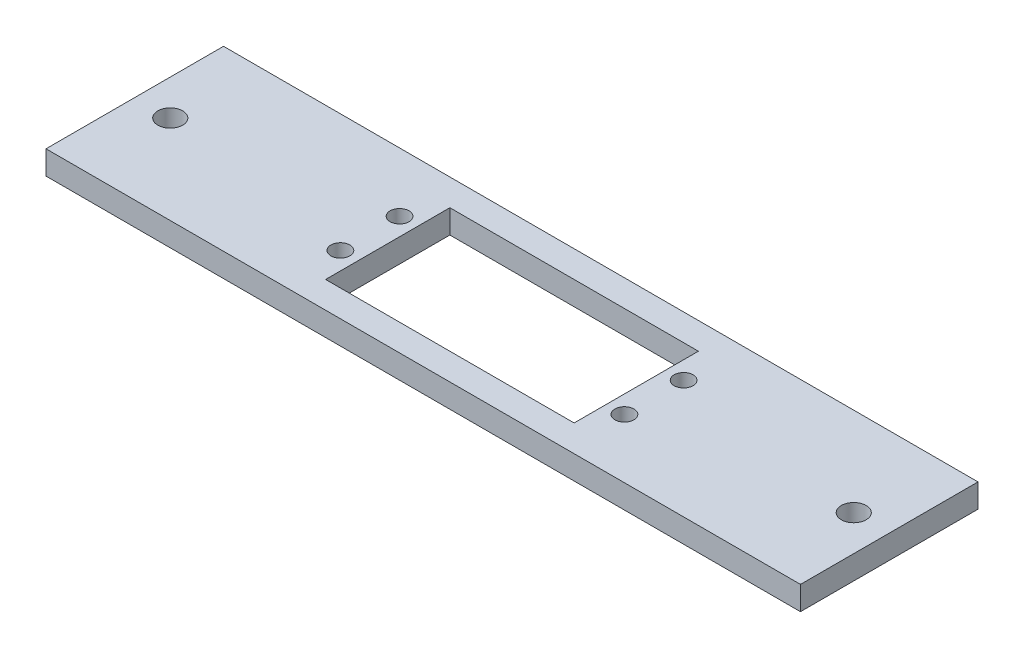
ISO-10303-21;
HEADER;
FILE_DESCRIPTION(('STEP AP214'),'2;1');
FILE_NAME('part.step','',(''),(''),'','','');
FILE_SCHEMA(('AUTOMOTIVE_DESIGN { 1 0 10303 214 1 1 1 1 }'));
ENDSEC;
DATA;
#1=APPLICATION_CONTEXT('core data for automotive mechanical design processes');
#2=APPLICATION_PROTOCOL_DEFINITION('international standard','automotive_design',2000,#1);
#3=PRODUCT_CONTEXT('',#1,'mechanical');
#4=PRODUCT('Part','Part','',(#3));
#5=PRODUCT_RELATED_PRODUCT_CATEGORY('part','',(#4));
#6=PRODUCT_DEFINITION_FORMATION('','',#4);
#7=PRODUCT_DEFINITION_CONTEXT('part definition',#1,'design');
#8=PRODUCT_DEFINITION('design','',#6,#7);
#9=PRODUCT_DEFINITION_SHAPE('','',#8);
#10=(LENGTH_UNIT() NAMED_UNIT(*) SI_UNIT(.MILLI.,.METRE.));
#11=(NAMED_UNIT(*) PLANE_ANGLE_UNIT() SI_UNIT($,.RADIAN.));
#12=(NAMED_UNIT(*) SI_UNIT($,.STERADIAN.) SOLID_ANGLE_UNIT());
#13=UNCERTAINTY_MEASURE_WITH_UNIT(LENGTH_MEASURE(1.E-05),#10,'distance_accuracy_value','');
#14=(GEOMETRIC_REPRESENTATION_CONTEXT(3) GLOBAL_UNCERTAINTY_ASSIGNED_CONTEXT((#13)) GLOBAL_UNIT_ASSIGNED_CONTEXT((#10,
#11,#12)) REPRESENTATION_CONTEXT('',''));
#15=CARTESIAN_POINT('',(0.,0.,0.));
#16=DIRECTION('',(0.,0.,1.));
#17=DIRECTION('',(1.,0.,0.));
#18=AXIS2_PLACEMENT_3D('',#15,#16,#17);
#19=CARTESIAN_POINT('',(0.,4.,0.));
#20=DIRECTION('',(0.,1.,0.));
#21=DIRECTION('',(0.,0.,1.));
#22=AXIS2_PLACEMENT_3D('',#19,#20,#21);
#23=PLANE('',#22);
#24=CARTESIAN_POINT('',(24.,4.,-5.));
#25=DIRECTION('',(0.,1.,0.));
#26=DIRECTION('',(0.,0.,-1.));
#27=AXIS2_PLACEMENT_3D('',#24,#25,#26);
#28=CIRCLE('',#27,1.6);
#29=CARTESIAN_POINT('',(24.,4.,-6.6));
#30=VERTEX_POINT('',#29);
#31=EDGE_CURVE('E298',#30,#30,#28,.T.);
#32=ORIENTED_EDGE('',*,*,#31,.F.);
#33=EDGE_LOOP('',(#32));
#34=FACE_BOUND('',#33,.T.);
#35=CARTESIAN_POINT('',(24.,4.,4.99999999999999));
#36=DIRECTION('',(0.,1.,0.));
#37=DIRECTION('',(0.,0.,1.));
#38=AXIS2_PLACEMENT_3D('',#35,#36,#37);
#39=CIRCLE('',#38,1.6);
#40=CARTESIAN_POINT('',(24.,4.,6.6));
#41=VERTEX_POINT('',#40);
#42=EDGE_CURVE('E288',#41,#41,#39,.T.);
#43=ORIENTED_EDGE('',*,*,#42,.F.);
#44=EDGE_LOOP('',(#43));
#45=FACE_BOUND('',#44,.T.);
#46=CARTESIAN_POINT('',(-24.,4.,5.));
#47=DIRECTION('',(0.,1.,0.));
#48=DIRECTION('',(0.,0.,-1.));
#49=AXIS2_PLACEMENT_3D('',#46,#47,#48);
#50=CIRCLE('',#49,1.6);
#51=CARTESIAN_POINT('',(-24.,4.,3.4));
#52=VERTEX_POINT('',#51);
#53=EDGE_CURVE('E278',#52,#52,#50,.T.);
#54=ORIENTED_EDGE('',*,*,#53,.F.);
#55=EDGE_LOOP('',(#54));
#56=FACE_BOUND('',#55,.T.);
#57=CARTESIAN_POINT('',(-24.,4.,-5.));
#58=DIRECTION('',(0.,1.,0.));
#59=DIRECTION('',(0.,0.,1.));
#60=AXIS2_PLACEMENT_3D('',#57,#58,#59);
#61=CIRCLE('',#60,1.6);
#62=CARTESIAN_POINT('',(-24.,4.,-3.4));
#63=VERTEX_POINT('',#62);
#64=EDGE_CURVE('E285',#63,#63,#61,.T.);
#65=ORIENTED_EDGE('',*,*,#64,.F.);
#66=EDGE_LOOP('',(#65));
#67=FACE_BOUND('',#66,.T.);
#68=CARTESIAN_POINT('',(-57.75,4.,0.));
#69=DIRECTION('',(0.,1.,0.));
#70=DIRECTION('',(0.,0.,1.));
#71=AXIS2_PLACEMENT_3D('',#68,#69,#70);
#72=CIRCLE('',#71,2.1);
#73=CARTESIAN_POINT('',(-57.75,4.,2.1));
#74=VERTEX_POINT('',#73);
#75=EDGE_CURVE('E140',#74,#74,#72,.T.);
#76=ORIENTED_EDGE('',*,*,#75,.F.);
#77=EDGE_LOOP('',(#76));
#78=FACE_BOUND('',#77,.T.);
#79=DIRECTION('',(0.,0.,1.));
#80=VECTOR('',#79,1.);
#81=CARTESIAN_POINT('',(-63.75,4.,-15.));
#82=LINE('',#81,#80);
#83=CARTESIAN_POINT('',(-63.75,4.,-15.));
#84=VERTEX_POINT('',#83);
#85=CARTESIAN_POINT('',(-63.75,4.,15.));
#86=VERTEX_POINT('',#85);
#87=EDGE_CURVE('E156',#84,#86,#82,.T.);
#88=ORIENTED_EDGE('',*,*,#87,.T.);
#89=DIRECTION('',(1.,0.,0.));
#90=VECTOR('',#89,1.);
#91=CARTESIAN_POINT('',(-63.75,4.,15.));
#92=LINE('',#91,#90);
#93=CARTESIAN_POINT('',(63.75,4.,15.));
#94=VERTEX_POINT('',#93);
#95=EDGE_CURVE('E160',#86,#94,#92,.T.);
#96=ORIENTED_EDGE('',*,*,#95,.T.);
#97=DIRECTION('',(0.,0.,-1.));
#98=VECTOR('',#97,1.);
#99=CARTESIAN_POINT('',(63.75,4.,-15.));
#100=LINE('',#99,#98);
#101=CARTESIAN_POINT('',(63.75,4.,-15.));
#102=VERTEX_POINT('',#101);
#103=EDGE_CURVE('E164',#94,#102,#100,.T.);
#104=ORIENTED_EDGE('',*,*,#103,.T.);
#105=DIRECTION('',(-1.,0.,0.));
#106=VECTOR('',#105,1.);
#107=CARTESIAN_POINT('',(-63.75,4.,-15.));
#108=LINE('',#107,#106);
#109=EDGE_CURVE('E167',#102,#84,#108,.T.);
#110=ORIENTED_EDGE('',*,*,#109,.T.);
#111=EDGE_LOOP('',(#88,#96,#104,#110));
#112=FACE_BOUND('',#111,.T.);
#113=DIRECTION('',(-1.,0.,0.));
#114=VECTOR('',#113,1.);
#115=CARTESIAN_POINT('',(-21.,4.,-10.5));
#116=LINE('',#115,#114);
#117=CARTESIAN_POINT('',(21.,4.,-10.5));
#118=VERTEX_POINT('',#117);
#119=CARTESIAN_POINT('',(-21.,4.,-10.5));
#120=VERTEX_POINT('',#119);
#121=EDGE_CURVE('E114',#118,#120,#116,.T.);
#122=ORIENTED_EDGE('',*,*,#121,.F.);
#123=DIRECTION('',(0.,0.,-1.));
#124=VECTOR('',#123,1.);
#125=CARTESIAN_POINT('',(21.,4.,10.5));
#126=LINE('',#125,#124);
#127=CARTESIAN_POINT('',(21.,4.,10.5));
#128=VERTEX_POINT('',#127);
#129=EDGE_CURVE('E105',#128,#118,#126,.T.);
#130=ORIENTED_EDGE('',*,*,#129,.F.);
#131=DIRECTION('',(1.,0.,0.));
#132=VECTOR('',#131,1.);
#133=CARTESIAN_POINT('',(-21.,4.,10.5));
#134=LINE('',#133,#132);
#135=CARTESIAN_POINT('',(-21.,4.,10.5));
#136=VERTEX_POINT('',#135);
#137=EDGE_CURVE('E132',#136,#128,#134,.T.);
#138=ORIENTED_EDGE('',*,*,#137,.F.);
#139=DIRECTION('',(0.,0.,1.));
#140=VECTOR('',#139,1.);
#141=CARTESIAN_POINT('',(-21.,4.,10.5));
#142=LINE('',#141,#140);
#143=EDGE_CURVE('E128',#120,#136,#142,.T.);
#144=ORIENTED_EDGE('',*,*,#143,.F.);
#145=EDGE_LOOP('',(#122,#130,#138,#144));
#146=FACE_BOUND('',#145,.T.);
#147=CARTESIAN_POINT('',(57.75,4.,0.));
#148=DIRECTION('',(0.,1.,0.));
#149=DIRECTION('',(0.,0.,-1.));
#150=AXIS2_PLACEMENT_3D('',#147,#148,#149);
#151=CIRCLE('',#150,2.1);
#152=CARTESIAN_POINT('',(57.75,4.,-2.10000000000001));
#153=VERTEX_POINT('',#152);
#154=EDGE_CURVE('E310',#153,#153,#151,.T.);
#155=ORIENTED_EDGE('',*,*,#154,.F.);
#156=EDGE_LOOP('',(#155));
#157=FACE_BOUND('',#156,.T.);
#158=ADVANCED_FACE('F39',(#34,#45,#56,#67,#78,#112,#146,#157),#23,.T.);
#159=CARTESIAN_POINT('',(0.,0.,0.));
#160=DIRECTION('',(0.,1.,0.));
#161=DIRECTION('',(0.,0.,1.));
#162=AXIS2_PLACEMENT_3D('',#159,#160,#161);
#163=PLANE('',#162);
#164=CARTESIAN_POINT('',(24.,0.,-5.));
#165=DIRECTION('',(0.,1.,0.));
#166=DIRECTION('',(0.,0.,-1.));
#167=AXIS2_PLACEMENT_3D('',#164,#165,#166);
#168=CIRCLE('',#167,1.6);
#169=CARTESIAN_POINT('',(24.,0.,-6.6));
#170=VERTEX_POINT('',#169);
#171=EDGE_CURVE('E294',#170,#170,#168,.T.);
#172=ORIENTED_EDGE('',*,*,#171,.T.);
#173=EDGE_LOOP('',(#172));
#174=FACE_BOUND('',#173,.T.);
#175=CARTESIAN_POINT('',(24.,0.,4.99999999999999));
#176=DIRECTION('',(0.,1.,0.));
#177=DIRECTION('',(0.,0.,1.));
#178=AXIS2_PLACEMENT_3D('',#175,#176,#177);
#179=CIRCLE('',#178,1.6);
#180=CARTESIAN_POINT('',(24.,0.,6.6));
#181=VERTEX_POINT('',#180);
#182=EDGE_CURVE('E281',#181,#181,#179,.T.);
#183=ORIENTED_EDGE('',*,*,#182,.T.);
#184=EDGE_LOOP('',(#183));
#185=FACE_BOUND('',#184,.T.);
#186=CARTESIAN_POINT('',(-24.,0.,5.));
#187=DIRECTION('',(0.,1.,0.));
#188=DIRECTION('',(0.,0.,-1.));
#189=AXIS2_PLACEMENT_3D('',#186,#187,#188);
#190=CIRCLE('',#189,1.6);
#191=CARTESIAN_POINT('',(-24.,0.,3.4));
#192=VERTEX_POINT('',#191);
#193=EDGE_CURVE('E275',#192,#192,#190,.T.);
#194=ORIENTED_EDGE('',*,*,#193,.T.);
#195=EDGE_LOOP('',(#194));
#196=FACE_BOUND('',#195,.T.);
#197=CARTESIAN_POINT('',(-24.,0.,-5.));
#198=DIRECTION('',(0.,1.,0.));
#199=DIRECTION('',(0.,0.,1.));
#200=AXIS2_PLACEMENT_3D('',#197,#198,#199);
#201=CIRCLE('',#200,1.6);
#202=CARTESIAN_POINT('',(-24.,0.,-3.4));
#203=VERTEX_POINT('',#202);
#204=EDGE_CURVE('E302',#203,#203,#201,.T.);
#205=ORIENTED_EDGE('',*,*,#204,.T.);
#206=EDGE_LOOP('',(#205));
#207=FACE_BOUND('',#206,.T.);
#208=DIRECTION('',(0.,0.,1.));
#209=VECTOR('',#208,1.);
#210=CARTESIAN_POINT('',(-63.75,0.,-15.));
#211=LINE('',#210,#209);
#212=CARTESIAN_POINT('',(-63.75,0.,-15.));
#213=VERTEX_POINT('',#212);
#214=CARTESIAN_POINT('',(-63.75,0.,15.));
#215=VERTEX_POINT('',#214);
#216=EDGE_CURVE('E123',#213,#215,#211,.T.);
#217=ORIENTED_EDGE('',*,*,#216,.F.);
#218=DIRECTION('',(-1.,0.,0.));
#219=VECTOR('',#218,1.);
#220=CARTESIAN_POINT('',(-63.75,0.,-15.));
#221=LINE('',#220,#219);
#222=CARTESIAN_POINT('',(63.75,0.,-15.));
#223=VERTEX_POINT('',#222);
#224=EDGE_CURVE('E161',#223,#213,#221,.T.);
#225=ORIENTED_EDGE('',*,*,#224,.F.);
#226=DIRECTION('',(0.,0.,-1.));
#227=VECTOR('',#226,1.);
#228=CARTESIAN_POINT('',(63.75,0.,-15.));
#229=LINE('',#228,#227);
#230=CARTESIAN_POINT('',(63.75,0.,15.));
#231=VERTEX_POINT('',#230);
#232=EDGE_CURVE('E177',#231,#223,#229,.T.);
#233=ORIENTED_EDGE('',*,*,#232,.F.);
#234=DIRECTION('',(1.,0.,0.));
#235=VECTOR('',#234,1.);
#236=CARTESIAN_POINT('',(-63.75,0.,15.));
#237=LINE('',#236,#235);
#238=EDGE_CURVE('E174',#215,#231,#237,.T.);
#239=ORIENTED_EDGE('',*,*,#238,.F.);
#240=EDGE_LOOP('',(#217,#225,#233,#239));
#241=FACE_BOUND('',#240,.T.);
#242=DIRECTION('',(0.,0.,-1.));
#243=VECTOR('',#242,1.);
#244=CARTESIAN_POINT('',(21.,0.,10.5));
#245=LINE('',#244,#243);
#246=CARTESIAN_POINT('',(21.,0.,10.5));
#247=VERTEX_POINT('',#246);
#248=CARTESIAN_POINT('',(21.,0.,-10.5));
#249=VERTEX_POINT('',#248);
#250=EDGE_CURVE('E63',#247,#249,#245,.T.);
#251=ORIENTED_EDGE('',*,*,#250,.T.);
#252=DIRECTION('',(-1.,0.,0.));
#253=VECTOR('',#252,1.);
#254=CARTESIAN_POINT('',(-21.,0.,-10.5));
#255=LINE('',#254,#253);
#256=CARTESIAN_POINT('',(-21.,0.,-10.5));
#257=VERTEX_POINT('',#256);
#258=EDGE_CURVE('E121',#249,#257,#255,.T.);
#259=ORIENTED_EDGE('',*,*,#258,.T.);
#260=DIRECTION('',(0.,0.,1.));
#261=VECTOR('',#260,1.);
#262=CARTESIAN_POINT('',(-21.,0.,10.5));
#263=LINE('',#262,#261);
#264=CARTESIAN_POINT('',(-21.,0.,10.5));
#265=VERTEX_POINT('',#264);
#266=EDGE_CURVE('E143',#257,#265,#263,.T.);
#267=ORIENTED_EDGE('',*,*,#266,.T.);
#268=DIRECTION('',(1.,0.,0.));
#269=VECTOR('',#268,1.);
#270=CARTESIAN_POINT('',(-21.,0.,10.5));
#271=LINE('',#270,#269);
#272=EDGE_CURVE('E115',#265,#247,#271,.T.);
#273=ORIENTED_EDGE('',*,*,#272,.T.);
#274=EDGE_LOOP('',(#251,#259,#267,#273));
#275=FACE_BOUND('',#274,.T.);
#276=CARTESIAN_POINT('',(-57.75,0.,0.));
#277=DIRECTION('',(0.,1.,0.));
#278=DIRECTION('',(0.,0.,1.));
#279=AXIS2_PLACEMENT_3D('',#276,#277,#278);
#280=CIRCLE('',#279,2.1);
#281=CARTESIAN_POINT('',(-57.75,0.,2.1));
#282=VERTEX_POINT('',#281);
#283=EDGE_CURVE('E314',#282,#282,#280,.T.);
#284=ORIENTED_EDGE('',*,*,#283,.T.);
#285=EDGE_LOOP('',(#284));
#286=FACE_BOUND('',#285,.T.);
#287=CARTESIAN_POINT('',(57.75,0.,0.));
#288=DIRECTION('',(0.,1.,0.));
#289=DIRECTION('',(0.,0.,-1.));
#290=AXIS2_PLACEMENT_3D('',#287,#288,#289);
#291=CIRCLE('',#290,2.1);
#292=CARTESIAN_POINT('',(57.75,0.,-2.10000000000001));
#293=VERTEX_POINT('',#292);
#294=EDGE_CURVE('E306',#293,#293,#291,.T.);
#295=ORIENTED_EDGE('',*,*,#294,.T.);
#296=EDGE_LOOP('',(#295));
#297=FACE_BOUND('',#296,.T.);
#298=ADVANCED_FACE('F200',(#174,#185,#196,#207,#241,#275,#286,#297),#163,.F.);
#299=CARTESIAN_POINT('',(-63.75,4.,-15.));
#300=DIRECTION('',(1.,0.,0.));
#301=DIRECTION('',(0.,0.,-1.));
#302=AXIS2_PLACEMENT_3D('',#299,#300,#301);
#303=PLANE('',#302);
#304=ORIENTED_EDGE('',*,*,#216,.T.);
#305=DIRECTION('',(0.,-1.,0.));
#306=VECTOR('',#305,1.);
#307=CARTESIAN_POINT('',(-63.75,4.,15.));
#308=LINE('',#307,#306);
#309=EDGE_CURVE('E11',#86,#215,#308,.T.);
#310=ORIENTED_EDGE('',*,*,#309,.F.);
#311=ORIENTED_EDGE('',*,*,#87,.F.);
#312=DIRECTION('',(0.,-1.,0.));
#313=VECTOR('',#312,1.);
#314=CARTESIAN_POINT('',(-63.75,4.,-15.));
#315=LINE('',#314,#313);
#316=EDGE_CURVE('E170',#84,#213,#315,.T.);
#317=ORIENTED_EDGE('',*,*,#316,.T.);
#318=EDGE_LOOP('',(#304,#310,#311,#317));
#319=FACE_BOUND('',#318,.T.);
#320=ADVANCED_FACE('F41',(#319),#303,.F.);
#321=CARTESIAN_POINT('',(-63.75,4.,15.));
#322=DIRECTION('',(0.,0.,-1.));
#323=DIRECTION('',(-1.,0.,0.));
#324=AXIS2_PLACEMENT_3D('',#321,#322,#323);
#325=PLANE('',#324);
#326=ORIENTED_EDGE('',*,*,#238,.T.);
#327=DIRECTION('',(0.,-1.,0.));
#328=VECTOR('',#327,1.);
#329=CARTESIAN_POINT('',(63.75,4.,15.));
#330=LINE('',#329,#328);
#331=EDGE_CURVE('E48',#94,#231,#330,.T.);
#332=ORIENTED_EDGE('',*,*,#331,.F.);
#333=ORIENTED_EDGE('',*,*,#95,.F.);
#334=ORIENTED_EDGE('',*,*,#309,.T.);
#335=EDGE_LOOP('',(#326,#332,#333,#334));
#336=FACE_BOUND('',#335,.T.);
#337=ADVANCED_FACE('F210',(#336),#325,.F.);
#338=CARTESIAN_POINT('',(63.75,4.,-15.));
#339=DIRECTION('',(-1.,0.,0.));
#340=DIRECTION('',(0.,0.,1.));
#341=AXIS2_PLACEMENT_3D('',#338,#339,#340);
#342=PLANE('',#341);
#343=ORIENTED_EDGE('',*,*,#232,.T.);
#344=DIRECTION('',(0.,-1.,0.));
#345=VECTOR('',#344,1.);
#346=CARTESIAN_POINT('',(63.75,4.,-15.));
#347=LINE('',#346,#345);
#348=EDGE_CURVE('E185',#102,#223,#347,.T.);
#349=ORIENTED_EDGE('',*,*,#348,.F.);
#350=ORIENTED_EDGE('',*,*,#103,.F.);
#351=ORIENTED_EDGE('',*,*,#331,.T.);
#352=EDGE_LOOP('',(#343,#349,#350,#351));
#353=FACE_BOUND('',#352,.T.);
#354=ADVANCED_FACE('F194',(#353),#342,.F.);
#355=CARTESIAN_POINT('',(-63.75,4.,-15.));
#356=DIRECTION('',(0.,0.,1.));
#357=DIRECTION('',(1.,0.,0.));
#358=AXIS2_PLACEMENT_3D('',#355,#356,#357);
#359=PLANE('',#358);
#360=ORIENTED_EDGE('',*,*,#224,.T.);
#361=ORIENTED_EDGE('',*,*,#316,.F.);
#362=ORIENTED_EDGE('',*,*,#109,.F.);
#363=ORIENTED_EDGE('',*,*,#348,.T.);
#364=EDGE_LOOP('',(#360,#361,#362,#363));
#365=FACE_BOUND('',#364,.T.);
#366=ADVANCED_FACE('F204',(#365),#359,.F.);
#367=CARTESIAN_POINT('',(21.,4.,10.5));
#368=DIRECTION('',(-1.,0.,0.));
#369=DIRECTION('',(0.,0.,1.));
#370=AXIS2_PLACEMENT_3D('',#367,#368,#369);
#371=PLANE('',#370);
#372=ORIENTED_EDGE('',*,*,#250,.F.);
#373=DIRECTION('',(0.,-1.,0.));
#374=VECTOR('',#373,1.);
#375=CARTESIAN_POINT('',(21.,4.,10.5));
#376=LINE('',#375,#374);
#377=EDGE_CURVE('E109',#128,#247,#376,.T.);
#378=ORIENTED_EDGE('',*,*,#377,.F.);
#379=ORIENTED_EDGE('',*,*,#129,.T.);
#380=DIRECTION('',(0.,-1.,0.));
#381=VECTOR('',#380,1.);
#382=CARTESIAN_POINT('',(21.,4.,-10.5));
#383=LINE('',#382,#381);
#384=EDGE_CURVE('E108',#118,#249,#383,.T.);
#385=ORIENTED_EDGE('',*,*,#384,.T.);
#386=EDGE_LOOP('',(#372,#378,#379,#385));
#387=FACE_BOUND('',#386,.T.);
#388=ADVANCED_FACE('F107',(#387),#371,.T.);
#389=CARTESIAN_POINT('',(-21.,4.,-10.5));
#390=DIRECTION('',(0.,0.,1.));
#391=DIRECTION('',(1.,0.,0.));
#392=AXIS2_PLACEMENT_3D('',#389,#390,#391);
#393=PLANE('',#392);
#394=ORIENTED_EDGE('',*,*,#258,.F.);
#395=ORIENTED_EDGE('',*,*,#384,.F.);
#396=ORIENTED_EDGE('',*,*,#121,.T.);
#397=DIRECTION('',(0.,-1.,0.));
#398=VECTOR('',#397,1.);
#399=CARTESIAN_POINT('',(-21.,4.,-10.5));
#400=LINE('',#399,#398);
#401=EDGE_CURVE('E124',#120,#257,#400,.T.);
#402=ORIENTED_EDGE('',*,*,#401,.T.);
#403=EDGE_LOOP('',(#394,#395,#396,#402));
#404=FACE_BOUND('',#403,.T.);
#405=ADVANCED_FACE('F118',(#404),#393,.T.);
#406=CARTESIAN_POINT('',(-21.,4.,10.5));
#407=DIRECTION('',(1.,0.,0.));
#408=DIRECTION('',(0.,0.,-1.));
#409=AXIS2_PLACEMENT_3D('',#406,#407,#408);
#410=PLANE('',#409);
#411=ORIENTED_EDGE('',*,*,#266,.F.);
#412=ORIENTED_EDGE('',*,*,#401,.F.);
#413=ORIENTED_EDGE('',*,*,#143,.T.);
#414=DIRECTION('',(0.,-1.,0.));
#415=VECTOR('',#414,1.);
#416=CARTESIAN_POINT('',(-21.,4.,10.5));
#417=LINE('',#416,#415);
#418=EDGE_CURVE('E55',#136,#265,#417,.T.);
#419=ORIENTED_EDGE('',*,*,#418,.T.);
#420=EDGE_LOOP('',(#411,#412,#413,#419));
#421=FACE_BOUND('',#420,.T.);
#422=ADVANCED_FACE('F237',(#421),#410,.T.);
#423=CARTESIAN_POINT('',(-21.,4.,10.5));
#424=DIRECTION('',(0.,0.,-1.));
#425=DIRECTION('',(-1.,0.,0.));
#426=AXIS2_PLACEMENT_3D('',#423,#424,#425);
#427=PLANE('',#426);
#428=ORIENTED_EDGE('',*,*,#272,.F.);
#429=ORIENTED_EDGE('',*,*,#418,.F.);
#430=ORIENTED_EDGE('',*,*,#137,.T.);
#431=ORIENTED_EDGE('',*,*,#377,.T.);
#432=EDGE_LOOP('',(#428,#429,#430,#431));
#433=FACE_BOUND('',#432,.T.);
#434=ADVANCED_FACE('F241',(#433),#427,.T.);
#435=CARTESIAN_POINT('',(-57.75,4.,0.));
#436=DIRECTION('',(0.,-1.,0.));
#437=DIRECTION('',(0.,0.,-1.));
#438=AXIS2_PLACEMENT_3D('',#435,#436,#437);
#439=CYLINDRICAL_SURFACE('',#438,2.1);
#440=ORIENTED_EDGE('',*,*,#75,.T.);
#441=EDGE_LOOP('',(#440));
#442=FACE_BOUND('',#441,.T.);
#443=ORIENTED_EDGE('',*,*,#283,.F.);
#444=EDGE_LOOP('',(#443));
#445=FACE_BOUND('',#444,.T.);
#446=ADVANCED_FACE('F247',(#442,#445),#439,.F.);
#447=CARTESIAN_POINT('',(57.75,4.,0.));
#448=DIRECTION('',(0.,-1.,0.));
#449=DIRECTION('',(0.,0.,-1.));
#450=AXIS2_PLACEMENT_3D('',#447,#448,#449);
#451=CYLINDRICAL_SURFACE('',#450,2.1);
#452=ORIENTED_EDGE('',*,*,#154,.T.);
#453=EDGE_LOOP('',(#452));
#454=FACE_BOUND('',#453,.T.);
#455=ORIENTED_EDGE('',*,*,#294,.F.);
#456=EDGE_LOOP('',(#455));
#457=FACE_BOUND('',#456,.T.);
#458=ADVANCED_FACE('F250',(#454,#457),#451,.F.);
#459=CARTESIAN_POINT('',(-24.,0.,-5.));
#460=DIRECTION('',(0.,1.,0.));
#461=DIRECTION('',(0.,0.,1.));
#462=AXIS2_PLACEMENT_3D('',#459,#460,#461);
#463=CYLINDRICAL_SURFACE('',#462,1.6);
#464=ORIENTED_EDGE('',*,*,#204,.F.);
#465=EDGE_LOOP('',(#464));
#466=FACE_BOUND('',#465,.T.);
#467=ORIENTED_EDGE('',*,*,#64,.T.);
#468=EDGE_LOOP('',(#467));
#469=FACE_BOUND('',#468,.T.);
#470=ADVANCED_FACE('F254',(#466,#469),#463,.F.);
#471=CARTESIAN_POINT('',(-24.,0.,5.));
#472=DIRECTION('',(0.,1.,0.));
#473=DIRECTION('',(0.,0.,1.));
#474=AXIS2_PLACEMENT_3D('',#471,#472,#473);
#475=CYLINDRICAL_SURFACE('',#474,1.6);
#476=ORIENTED_EDGE('',*,*,#193,.F.);
#477=EDGE_LOOP('',(#476));
#478=FACE_BOUND('',#477,.T.);
#479=ORIENTED_EDGE('',*,*,#53,.T.);
#480=EDGE_LOOP('',(#479));
#481=FACE_BOUND('',#480,.T.);
#482=ADVANCED_FACE('F258',(#478,#481),#475,.F.);
#483=CARTESIAN_POINT('',(24.,0.,4.99999999999999));
#484=DIRECTION('',(0.,1.,0.));
#485=DIRECTION('',(0.,0.,1.));
#486=AXIS2_PLACEMENT_3D('',#483,#484,#485);
#487=CYLINDRICAL_SURFACE('',#486,1.6);
#488=ORIENTED_EDGE('',*,*,#182,.F.);
#489=EDGE_LOOP('',(#488));
#490=FACE_BOUND('',#489,.T.);
#491=ORIENTED_EDGE('',*,*,#42,.T.);
#492=EDGE_LOOP('',(#491));
#493=FACE_BOUND('',#492,.T.);
#494=ADVANCED_FACE('F263',(#490,#493),#487,.F.);
#495=CARTESIAN_POINT('',(24.,0.,-5.));
#496=DIRECTION('',(0.,1.,0.));
#497=DIRECTION('',(0.,0.,1.));
#498=AXIS2_PLACEMENT_3D('',#495,#496,#497);
#499=CYLINDRICAL_SURFACE('',#498,1.6);
#500=ORIENTED_EDGE('',*,*,#171,.F.);
#501=EDGE_LOOP('',(#500));
#502=FACE_BOUND('',#501,.T.);
#503=ORIENTED_EDGE('',*,*,#31,.T.);
#504=EDGE_LOOP('',(#503));
#505=FACE_BOUND('',#504,.T.);
#506=ADVANCED_FACE('F260',(#502,#505),#499,.F.);
#507=CLOSED_SHELL('',(#158,#298,#320,#337,#354,#366,#388,#405,#422,#434,#446,#458,#470,#482,
#494,#506));
#508=MANIFOLD_SOLID_BREP('B2',#507);
#509=ADVANCED_BREP_SHAPE_REPRESENTATION('',(#18,#508),#14);
#510=SHAPE_DEFINITION_REPRESENTATION(#9,#509);
ENDSEC;
END-ISO-10303-21;
